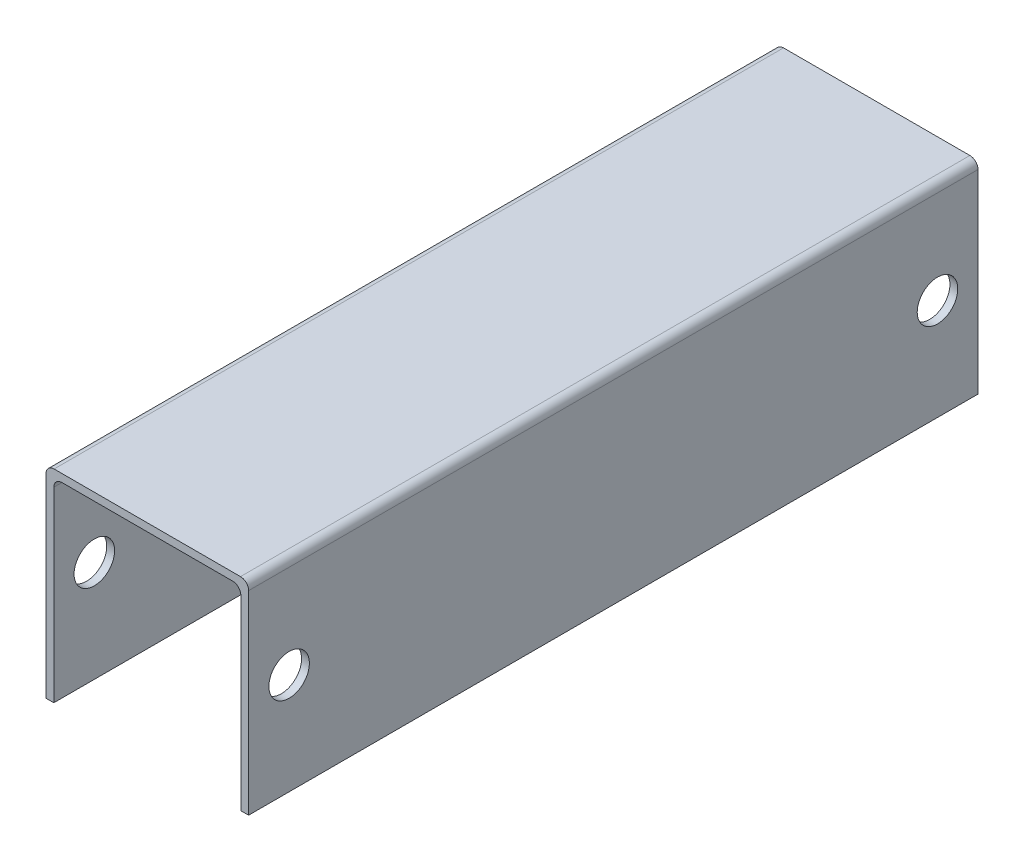
ISO-10303-21;
HEADER;
FILE_DESCRIPTION(('STEP AP214'),'2;1');
FILE_NAME('part.step','',(''),(''),'','','');
FILE_SCHEMA(('AUTOMOTIVE_DESIGN { 1 0 10303 214 1 1 1 1 }'));
ENDSEC;
DATA;
#1=APPLICATION_CONTEXT('core data for automotive mechanical design processes');
#2=APPLICATION_PROTOCOL_DEFINITION('international standard','automotive_design',2000,#1);
#3=PRODUCT_CONTEXT('',#1,'mechanical');
#4=PRODUCT('Part','Part','',(#3));
#5=PRODUCT_RELATED_PRODUCT_CATEGORY('part','',(#4));
#6=PRODUCT_DEFINITION_FORMATION('','',#4);
#7=PRODUCT_DEFINITION_CONTEXT('part definition',#1,'design');
#8=PRODUCT_DEFINITION('design','',#6,#7);
#9=PRODUCT_DEFINITION_SHAPE('','',#8);
#10=(LENGTH_UNIT() NAMED_UNIT(*) SI_UNIT(.MILLI.,.METRE.));
#11=(NAMED_UNIT(*) PLANE_ANGLE_UNIT() SI_UNIT($,.RADIAN.));
#12=(NAMED_UNIT(*) SI_UNIT($,.STERADIAN.) SOLID_ANGLE_UNIT());
#13=UNCERTAINTY_MEASURE_WITH_UNIT(LENGTH_MEASURE(1.E-05),#10,'distance_accuracy_value','');
#14=(GEOMETRIC_REPRESENTATION_CONTEXT(3) GLOBAL_UNCERTAINTY_ASSIGNED_CONTEXT((#13)) GLOBAL_UNIT_ASSIGNED_CONTEXT((#10,
#11,#12)) REPRESENTATION_CONTEXT('',''));
#15=CARTESIAN_POINT('',(0.,0.,0.));
#16=DIRECTION('',(0.,0.,1.));
#17=DIRECTION('',(1.,0.,0.));
#18=AXIS2_PLACEMENT_3D('',#15,#16,#17);
#19=CARTESIAN_POINT('',(1.92778,0.,180.));
#20=DIRECTION('',(0.,1.,0.));
#21=DIRECTION('',(-1.,0.,0.));
#22=AXIS2_PLACEMENT_3D('',#19,#20,#21);
#23=PLANE('',#22);
#24=DIRECTION('',(1.,0.,0.));
#25=VECTOR('',#24,1.);
#26=CARTESIAN_POINT('',(1.92778,0.,0.));
#27=LINE('',#26,#25);
#28=CARTESIAN_POINT('',(0.,0.,0.));
#29=VERTEX_POINT('',#28);
#30=CARTESIAN_POINT('',(1.92778,0.,0.));
#31=VERTEX_POINT('',#30);
#32=EDGE_CURVE('E156',#29,#31,#27,.T.);
#33=ORIENTED_EDGE('',*,*,#32,.T.);
#34=DIRECTION('',(0.,0.,-1.));
#35=VECTOR('',#34,1.);
#36=CARTESIAN_POINT('',(1.92778,0.,180.));
#37=LINE('',#36,#35);
#38=CARTESIAN_POINT('',(1.92778,0.,180.));
#39=VERTEX_POINT('',#38);
#40=EDGE_CURVE('E137',#39,#31,#37,.T.);
#41=ORIENTED_EDGE('',*,*,#40,.F.);
#42=DIRECTION('',(1.,0.,0.));
#43=VECTOR('',#42,1.);
#44=CARTESIAN_POINT('',(1.92778,0.,180.));
#45=LINE('',#44,#43);
#46=CARTESIAN_POINT('',(0.,0.,180.));
#47=VERTEX_POINT('',#46);
#48=EDGE_CURVE('E143',#47,#39,#45,.T.);
#49=ORIENTED_EDGE('',*,*,#48,.F.);
#50=DIRECTION('',(0.,0.,-1.));
#51=VECTOR('',#50,1.);
#52=CARTESIAN_POINT('',(0.,0.,180.));
#53=LINE('',#52,#51);
#54=EDGE_CURVE('E226',#47,#29,#53,.T.);
#55=ORIENTED_EDGE('',*,*,#54,.T.);
#56=EDGE_LOOP('',(#33,#41,#49,#55));
#57=FACE_BOUND('',#56,.T.);
#58=ADVANCED_FACE('F42',(#57),#23,.F.);
#59=CARTESIAN_POINT('',(1.92777999999999,48.07222,180.));
#60=DIRECTION('',(-1.,0.,0.));
#61=DIRECTION('',(0.,-1.,0.));
#62=AXIS2_PLACEMENT_3D('',#59,#60,#61);
#63=PLANE('',#62);
#64=CARTESIAN_POINT('',(1.92777999999999,25.,10.));
#65=DIRECTION('',(-1.,0.,0.));
#66=DIRECTION('',(0.,-1.,0.));
#67=AXIS2_PLACEMENT_3D('',#64,#65,#66);
#68=CIRCLE('',#67,5.);
#69=CARTESIAN_POINT('',(1.92777999999999,20.,10.));
#70=VERTEX_POINT('',#69);
#71=EDGE_CURVE('E228',#70,#70,#68,.T.);
#72=ORIENTED_EDGE('',*,*,#71,.T.);
#73=EDGE_LOOP('',(#72));
#74=FACE_BOUND('',#73,.T.);
#75=CARTESIAN_POINT('',(1.92777999999999,25.,170.));
#76=DIRECTION('',(-1.,0.,0.));
#77=DIRECTION('',(0.,-1.,0.));
#78=AXIS2_PLACEMENT_3D('',#75,#76,#77);
#79=CIRCLE('',#78,4.99999999999999);
#80=CARTESIAN_POINT('',(1.92777999999999,20.,170.));
#81=VERTEX_POINT('',#80);
#82=EDGE_CURVE('E308',#81,#81,#79,.T.);
#83=ORIENTED_EDGE('',*,*,#82,.T.);
#84=EDGE_LOOP('',(#83));
#85=FACE_BOUND('',#84,.T.);
#86=DIRECTION('',(0.,1.,0.));
#87=VECTOR('',#86,1.);
#88=CARTESIAN_POINT('',(1.92777999999999,48.07222,0.));
#89=LINE('',#88,#87);
#90=CARTESIAN_POINT('',(1.92777999999999,46.07222,0.));
#91=VERTEX_POINT('',#90);
#92=EDGE_CURVE('E209',#31,#91,#89,.T.);
#93=ORIENTED_EDGE('',*,*,#92,.T.);
#94=DIRECTION('',(0.,0.,-1.));
#95=VECTOR('',#94,1.);
#96=CARTESIAN_POINT('',(1.92777999999999,46.07222,180.));
#97=LINE('',#96,#95);
#98=CARTESIAN_POINT('',(1.92777999999999,46.07222,180.));
#99=VERTEX_POINT('',#98);
#100=EDGE_CURVE('E140',#91,#99,#97,.F.);
#101=ORIENTED_EDGE('',*,*,#100,.T.);
#102=DIRECTION('',(0.,1.,0.));
#103=VECTOR('',#102,1.);
#104=CARTESIAN_POINT('',(1.92777999999999,48.07222,180.));
#105=LINE('',#104,#103);
#106=EDGE_CURVE('E132',#39,#99,#105,.T.);
#107=ORIENTED_EDGE('',*,*,#106,.F.);
#108=ORIENTED_EDGE('',*,*,#40,.T.);
#109=EDGE_LOOP('',(#93,#101,#107,#108));
#110=FACE_BOUND('',#109,.T.);
#111=ADVANCED_FACE('F135',(#74,#85,#110),#63,.F.);
#112=CARTESIAN_POINT('',(48.07222,48.07222,180.));
#113=DIRECTION('',(0.,1.,0.));
#114=DIRECTION('',(-1.,0.,0.));
#115=AXIS2_PLACEMENT_3D('',#112,#113,#114);
#116=PLANE('',#115);
#117=DIRECTION('',(1.,0.,0.));
#118=VECTOR('',#117,1.);
#119=CARTESIAN_POINT('',(48.07222,48.07222,180.));
#120=LINE('',#119,#118);
#121=CARTESIAN_POINT('',(3.92778,48.07222,180.));
#122=VERTEX_POINT('',#121);
#123=CARTESIAN_POINT('',(46.07222,48.07222,180.));
#124=VERTEX_POINT('',#123);
#125=EDGE_CURVE('E142',#122,#124,#120,.T.);
#126=ORIENTED_EDGE('',*,*,#125,.F.);
#127=DIRECTION('',(0.,0.,-1.));
#128=VECTOR('',#127,1.);
#129=CARTESIAN_POINT('',(3.92778,48.07222,0.));
#130=LINE('',#129,#128);
#131=CARTESIAN_POINT('',(3.92778,48.07222,0.));
#132=VERTEX_POINT('',#131);
#133=EDGE_CURVE('E183',#122,#132,#130,.T.);
#134=ORIENTED_EDGE('',*,*,#133,.T.);
#135=DIRECTION('',(1.,0.,0.));
#136=VECTOR('',#135,1.);
#137=CARTESIAN_POINT('',(48.07222,48.07222,0.));
#138=LINE('',#137,#136);
#139=CARTESIAN_POINT('',(46.07222,48.07222,0.));
#140=VERTEX_POINT('',#139);
#141=EDGE_CURVE('E199',#132,#140,#138,.T.);
#142=ORIENTED_EDGE('',*,*,#141,.T.);
#143=DIRECTION('',(0.,0.,-1.));
#144=VECTOR('',#143,1.);
#145=CARTESIAN_POINT('',(46.07222,48.07222,180.));
#146=LINE('',#145,#144);
#147=EDGE_CURVE('E181',#140,#124,#146,.F.);
#148=ORIENTED_EDGE('',*,*,#147,.T.);
#149=EDGE_LOOP('',(#126,#134,#142,#148));
#150=FACE_BOUND('',#149,.T.);
#151=ADVANCED_FACE('F207',(#150),#116,.F.);
#152=CARTESIAN_POINT('',(48.07222,0.,180.));
#153=DIRECTION('',(1.,0.,0.));
#154=DIRECTION('',(0.,0.,-1.));
#155=AXIS2_PLACEMENT_3D('',#152,#153,#154);
#156=PLANE('',#155);
#157=CARTESIAN_POINT('',(48.07222,25.,10.));
#158=DIRECTION('',(1.,0.,0.));
#159=DIRECTION('',(0.,0.,-1.));
#160=AXIS2_PLACEMENT_3D('',#157,#158,#159);
#161=CIRCLE('',#160,5.);
#162=CARTESIAN_POINT('',(48.07222,25.,5.));
#163=VERTEX_POINT('',#162);
#164=EDGE_CURVE('E305',#163,#163,#161,.T.);
#165=ORIENTED_EDGE('',*,*,#164,.T.);
#166=EDGE_LOOP('',(#165));
#167=FACE_BOUND('',#166,.T.);
#168=CARTESIAN_POINT('',(48.07222,25.,170.));
#169=DIRECTION('',(1.,0.,0.));
#170=DIRECTION('',(0.,0.,-1.));
#171=AXIS2_PLACEMENT_3D('',#168,#169,#170);
#172=CIRCLE('',#171,4.99999999999999);
#173=CARTESIAN_POINT('',(48.07222,25.,165.));
#174=VERTEX_POINT('',#173);
#175=EDGE_CURVE('E313',#174,#174,#172,.T.);
#176=ORIENTED_EDGE('',*,*,#175,.T.);
#177=EDGE_LOOP('',(#176));
#178=FACE_BOUND('',#177,.T.);
#179=DIRECTION('',(0.,-1.,0.));
#180=VECTOR('',#179,1.);
#181=CARTESIAN_POINT('',(48.07222,0.,180.));
#182=LINE('',#181,#180);
#183=CARTESIAN_POINT('',(48.07222,46.07222,180.));
#184=VERTEX_POINT('',#183);
#185=CARTESIAN_POINT('',(48.07222,0.,180.));
#186=VERTEX_POINT('',#185);
#187=EDGE_CURVE('E214',#184,#186,#182,.T.);
#188=ORIENTED_EDGE('',*,*,#187,.F.);
#189=DIRECTION('',(0.,0.,-1.));
#190=VECTOR('',#189,1.);
#191=CARTESIAN_POINT('',(48.07222,46.07222,0.));
#192=LINE('',#191,#190);
#193=CARTESIAN_POINT('',(48.07222,46.07222,0.));
#194=VERTEX_POINT('',#193);
#195=EDGE_CURVE('E187',#184,#194,#192,.T.);
#196=ORIENTED_EDGE('',*,*,#195,.T.);
#197=DIRECTION('',(0.,-1.,0.));
#198=VECTOR('',#197,1.);
#199=CARTESIAN_POINT('',(48.07222,0.,0.));
#200=LINE('',#199,#198);
#201=CARTESIAN_POINT('',(48.07222,0.,0.));
#202=VERTEX_POINT('',#201);
#203=EDGE_CURVE('E201',#194,#202,#200,.T.);
#204=ORIENTED_EDGE('',*,*,#203,.T.);
#205=DIRECTION('',(0.,0.,-1.));
#206=VECTOR('',#205,1.);
#207=CARTESIAN_POINT('',(48.07222,0.,180.));
#208=LINE('',#207,#206);
#209=EDGE_CURVE('E158',#186,#202,#208,.T.);
#210=ORIENTED_EDGE('',*,*,#209,.F.);
#211=EDGE_LOOP('',(#188,#196,#204,#210));
#212=FACE_BOUND('',#211,.T.);
#213=ADVANCED_FACE('F212',(#167,#178,#212),#156,.F.);
#214=CARTESIAN_POINT('',(50.,0.,180.));
#215=DIRECTION('',(0.,1.,0.));
#216=DIRECTION('',(-1.,0.,0.));
#217=AXIS2_PLACEMENT_3D('',#214,#215,#216);
#218=PLANE('',#217);
#219=DIRECTION('',(1.,0.,0.));
#220=VECTOR('',#219,1.);
#221=CARTESIAN_POINT('',(50.,0.,0.));
#222=LINE('',#221,#220);
#223=CARTESIAN_POINT('',(50.,0.,0.));
#224=VERTEX_POINT('',#223);
#225=EDGE_CURVE('E231',#202,#224,#222,.T.);
#226=ORIENTED_EDGE('',*,*,#225,.T.);
#227=DIRECTION('',(0.,0.,-1.));
#228=VECTOR('',#227,1.);
#229=CARTESIAN_POINT('',(50.,0.,180.));
#230=LINE('',#229,#228);
#231=CARTESIAN_POINT('',(50.,0.,180.));
#232=VERTEX_POINT('',#231);
#233=EDGE_CURVE('E164',#232,#224,#230,.T.);
#234=ORIENTED_EDGE('',*,*,#233,.F.);
#235=DIRECTION('',(1.,0.,0.));
#236=VECTOR('',#235,1.);
#237=CARTESIAN_POINT('',(50.,0.,180.));
#238=LINE('',#237,#236);
#239=EDGE_CURVE('E216',#186,#232,#238,.T.);
#240=ORIENTED_EDGE('',*,*,#239,.F.);
#241=ORIENTED_EDGE('',*,*,#209,.T.);
#242=EDGE_LOOP('',(#226,#234,#240,#241));
#243=FACE_BOUND('',#242,.T.);
#244=ADVANCED_FACE('F332',(#243),#218,.F.);
#245=CARTESIAN_POINT('',(50.,50.,180.));
#246=DIRECTION('',(-1.,0.,0.));
#247=DIRECTION('',(0.,0.,1.));
#248=AXIS2_PLACEMENT_3D('',#245,#246,#247);
#249=PLANE('',#248);
#250=CARTESIAN_POINT('',(50.,25.,10.));
#251=DIRECTION('',(-1.,0.,0.));
#252=DIRECTION('',(0.,0.,1.));
#253=AXIS2_PLACEMENT_3D('',#250,#251,#252);
#254=CIRCLE('',#253,5.);
#255=CARTESIAN_POINT('',(50.,25.,15.));
#256=VERTEX_POINT('',#255);
#257=EDGE_CURVE('E316',#256,#256,#254,.T.);
#258=ORIENTED_EDGE('',*,*,#257,.T.);
#259=EDGE_LOOP('',(#258));
#260=FACE_BOUND('',#259,.T.);
#261=CARTESIAN_POINT('',(50.,25.,170.));
#262=DIRECTION('',(-1.,0.,0.));
#263=DIRECTION('',(0.,0.,1.));
#264=AXIS2_PLACEMENT_3D('',#261,#262,#263);
#265=CIRCLE('',#264,4.99999999999999);
#266=CARTESIAN_POINT('',(50.,25.,175.));
#267=VERTEX_POINT('',#266);
#268=EDGE_CURVE('E321',#267,#267,#265,.T.);
#269=ORIENTED_EDGE('',*,*,#268,.T.);
#270=EDGE_LOOP('',(#269));
#271=FACE_BOUND('',#270,.T.);
#272=DIRECTION('',(0.,1.,0.));
#273=VECTOR('',#272,1.);
#274=CARTESIAN_POINT('',(50.,50.,0.));
#275=LINE('',#274,#273);
#276=CARTESIAN_POINT('',(50.,48.,0.));
#277=VERTEX_POINT('',#276);
#278=EDGE_CURVE('E233',#224,#277,#275,.T.);
#279=ORIENTED_EDGE('',*,*,#278,.T.);
#280=DIRECTION('',(0.,0.,-1.));
#281=VECTOR('',#280,1.);
#282=CARTESIAN_POINT('',(50.,48.,180.));
#283=LINE('',#282,#281);
#284=CARTESIAN_POINT('',(50.,48.,180.));
#285=VERTEX_POINT('',#284);
#286=EDGE_CURVE('E57',#277,#285,#283,.F.);
#287=ORIENTED_EDGE('',*,*,#286,.T.);
#288=DIRECTION('',(0.,1.,0.));
#289=VECTOR('',#288,1.);
#290=CARTESIAN_POINT('',(50.,50.,180.));
#291=LINE('',#290,#289);
#292=EDGE_CURVE('E218',#232,#285,#291,.T.);
#293=ORIENTED_EDGE('',*,*,#292,.F.);
#294=ORIENTED_EDGE('',*,*,#233,.T.);
#295=EDGE_LOOP('',(#279,#287,#293,#294));
#296=FACE_BOUND('',#295,.T.);
#297=ADVANCED_FACE('F242',(#260,#271,#296),#249,.F.);
#298=CARTESIAN_POINT('',(0.,50.,180.));
#299=DIRECTION('',(0.,-1.,0.));
#300=DIRECTION('',(0.,0.,-1.));
#301=AXIS2_PLACEMENT_3D('',#298,#299,#300);
#302=PLANE('',#301);
#303=DIRECTION('',(-1.,0.,0.));
#304=VECTOR('',#303,1.);
#305=CARTESIAN_POINT('',(0.,50.,0.));
#306=LINE('',#305,#304);
#307=CARTESIAN_POINT('',(48.,50.,0.));
#308=VERTEX_POINT('',#307);
#309=CARTESIAN_POINT('',(2.,50.,0.));
#310=VERTEX_POINT('',#309);
#311=EDGE_CURVE('E235',#308,#310,#306,.T.);
#312=ORIENTED_EDGE('',*,*,#311,.T.);
#313=DIRECTION('',(0.,0.,-1.));
#314=VECTOR('',#313,1.);
#315=CARTESIAN_POINT('',(2.,50.,180.));
#316=LINE('',#315,#314);
#317=CARTESIAN_POINT('',(2.,50.,180.));
#318=VERTEX_POINT('',#317);
#319=EDGE_CURVE('E174',#310,#318,#316,.F.);
#320=ORIENTED_EDGE('',*,*,#319,.T.);
#321=DIRECTION('',(-1.,0.,0.));
#322=VECTOR('',#321,1.);
#323=CARTESIAN_POINT('',(0.,50.,180.));
#324=LINE('',#323,#322);
#325=CARTESIAN_POINT('',(48.,50.,180.));
#326=VERTEX_POINT('',#325);
#327=EDGE_CURVE('E223',#326,#318,#324,.T.);
#328=ORIENTED_EDGE('',*,*,#327,.F.);
#329=DIRECTION('',(0.,0.,-1.));
#330=VECTOR('',#329,1.);
#331=CARTESIAN_POINT('',(48.,50.,180.));
#332=LINE('',#331,#330);
#333=EDGE_CURVE('E171',#326,#308,#332,.T.);
#334=ORIENTED_EDGE('',*,*,#333,.T.);
#335=EDGE_LOOP('',(#312,#320,#328,#334));
#336=FACE_BOUND('',#335,.T.);
#337=ADVANCED_FACE('F251',(#336),#302,.F.);
#338=CARTESIAN_POINT('',(0.,0.,180.));
#339=DIRECTION('',(1.,0.,0.));
#340=DIRECTION('',(0.,0.,-1.));
#341=AXIS2_PLACEMENT_3D('',#338,#339,#340);
#342=PLANE('',#341);
#343=CARTESIAN_POINT('',(0.,25.,10.));
#344=DIRECTION('',(-1.,0.,0.));
#345=DIRECTION('',(0.,0.,1.));
#346=AXIS2_PLACEMENT_3D('',#343,#344,#345);
#347=CIRCLE('',#346,5.);
#348=CARTESIAN_POINT('',(0.,25.,15.));
#349=VERTEX_POINT('',#348);
#350=EDGE_CURVE('E302',#349,#349,#347,.T.);
#351=ORIENTED_EDGE('',*,*,#350,.F.);
#352=EDGE_LOOP('',(#351));
#353=FACE_BOUND('',#352,.T.);
#354=CARTESIAN_POINT('',(0.,25.,170.));
#355=DIRECTION('',(-1.,0.,0.));
#356=DIRECTION('',(0.,0.,1.));
#357=AXIS2_PLACEMENT_3D('',#354,#355,#356);
#358=CIRCLE('',#357,4.99999999999999);
#359=CARTESIAN_POINT('',(0.,25.,175.));
#360=VERTEX_POINT('',#359);
#361=EDGE_CURVE('E317',#360,#360,#358,.T.);
#362=ORIENTED_EDGE('',*,*,#361,.F.);
#363=EDGE_LOOP('',(#362));
#364=FACE_BOUND('',#363,.T.);
#365=DIRECTION('',(0.,-1.,0.));
#366=VECTOR('',#365,1.);
#367=CARTESIAN_POINT('',(0.,0.,180.));
#368=LINE('',#367,#366);
#369=CARTESIAN_POINT('',(0.,48.,180.));
#370=VERTEX_POINT('',#369);
#371=EDGE_CURVE('E149',#370,#47,#368,.T.);
#372=ORIENTED_EDGE('',*,*,#371,.F.);
#373=DIRECTION('',(0.,0.,-1.));
#374=VECTOR('',#373,1.);
#375=CARTESIAN_POINT('',(0.,48.,180.));
#376=LINE('',#375,#374);
#377=CARTESIAN_POINT('',(0.,48.,0.));
#378=VERTEX_POINT('',#377);
#379=EDGE_CURVE('E157',#370,#378,#376,.T.);
#380=ORIENTED_EDGE('',*,*,#379,.T.);
#381=DIRECTION('',(0.,-1.,0.));
#382=VECTOR('',#381,1.);
#383=CARTESIAN_POINT('',(0.,0.,0.));
#384=LINE('',#383,#382);
#385=EDGE_CURVE('E153',#378,#29,#384,.T.);
#386=ORIENTED_EDGE('',*,*,#385,.T.);
#387=ORIENTED_EDGE('',*,*,#54,.F.);
#388=EDGE_LOOP('',(#372,#380,#386,#387));
#389=FACE_BOUND('',#388,.T.);
#390=ADVANCED_FACE('F258',(#353,#364,#389),#342,.F.);
#391=CARTESIAN_POINT('',(0.,0.,180.));
#392=DIRECTION('',(0.,0.,-1.));
#393=DIRECTION('',(-1.,0.,0.));
#394=AXIS2_PLACEMENT_3D('',#391,#392,#393);
#395=PLANE('',#394);
#396=ORIENTED_EDGE('',*,*,#327,.T.);
#397=CARTESIAN_POINT('',(2.,48.,180.));
#398=DIRECTION('',(0.,0.,-1.));
#399=DIRECTION('',(-1.,0.,0.));
#400=AXIS2_PLACEMENT_3D('',#397,#398,#399);
#401=CIRCLE('',#400,2.);
#402=EDGE_CURVE('E178',#318,#370,#401,.F.);
#403=ORIENTED_EDGE('',*,*,#402,.T.);
#404=ORIENTED_EDGE('',*,*,#371,.T.);
#405=ORIENTED_EDGE('',*,*,#48,.T.);
#406=ORIENTED_EDGE('',*,*,#106,.T.);
#407=CARTESIAN_POINT('',(3.92778,46.07222,180.));
#408=DIRECTION('',(0.,0.,-1.));
#409=DIRECTION('',(-1.,0.,0.));
#410=AXIS2_PLACEMENT_3D('',#407,#408,#409);
#411=CIRCLE('',#410,2.);
#412=EDGE_CURVE('E192',#99,#122,#411,.T.);
#413=ORIENTED_EDGE('',*,*,#412,.T.);
#414=ORIENTED_EDGE('',*,*,#125,.T.);
#415=CARTESIAN_POINT('',(46.07222,46.07222,180.));
#416=DIRECTION('',(0.,0.,-1.));
#417=DIRECTION('',(-1.,0.,0.));
#418=AXIS2_PLACEMENT_3D('',#415,#416,#417);
#419=CIRCLE('',#418,2.);
#420=EDGE_CURVE('E11',#124,#184,#419,.T.);
#421=ORIENTED_EDGE('',*,*,#420,.T.);
#422=ORIENTED_EDGE('',*,*,#187,.T.);
#423=ORIENTED_EDGE('',*,*,#239,.T.);
#424=ORIENTED_EDGE('',*,*,#292,.T.);
#425=CARTESIAN_POINT('',(48.,48.,180.));
#426=DIRECTION('',(0.,0.,-1.));
#427=DIRECTION('',(-1.,0.,0.));
#428=AXIS2_PLACEMENT_3D('',#425,#426,#427);
#429=CIRCLE('',#428,2.);
#430=EDGE_CURVE('E176',#285,#326,#429,.F.);
#431=ORIENTED_EDGE('',*,*,#430,.T.);
#432=EDGE_LOOP('',(#396,#403,#404,#405,#406,#413,#414,#421,#422,#423,#424,#431));
#433=FACE_BOUND('',#432,.T.);
#434=ADVANCED_FACE('F147',(#433),#395,.F.);
#435=CARTESIAN_POINT('',(0.,0.,0.));
#436=DIRECTION('',(0.,0.,-1.));
#437=DIRECTION('',(-1.,0.,0.));
#438=AXIS2_PLACEMENT_3D('',#435,#436,#437);
#439=PLANE('',#438);
#440=ORIENTED_EDGE('',*,*,#385,.F.);
#441=CARTESIAN_POINT('',(2.,48.,0.));
#442=DIRECTION('',(0.,0.,-1.));
#443=DIRECTION('',(-1.,0.,0.));
#444=AXIS2_PLACEMENT_3D('',#441,#442,#443);
#445=CIRCLE('',#444,2.);
#446=EDGE_CURVE('E169',#378,#310,#445,.T.);
#447=ORIENTED_EDGE('',*,*,#446,.T.);
#448=ORIENTED_EDGE('',*,*,#311,.F.);
#449=CARTESIAN_POINT('',(48.,48.,0.));
#450=DIRECTION('',(0.,0.,-1.));
#451=DIRECTION('',(-1.,0.,0.));
#452=AXIS2_PLACEMENT_3D('',#449,#450,#451);
#453=CIRCLE('',#452,2.);
#454=EDGE_CURVE('E161',#308,#277,#453,.T.);
#455=ORIENTED_EDGE('',*,*,#454,.T.);
#456=ORIENTED_EDGE('',*,*,#278,.F.);
#457=ORIENTED_EDGE('',*,*,#225,.F.);
#458=ORIENTED_EDGE('',*,*,#203,.F.);
#459=CARTESIAN_POINT('',(46.07222,46.07222,0.));
#460=DIRECTION('',(0.,0.,-1.));
#461=DIRECTION('',(-1.,0.,0.));
#462=AXIS2_PLACEMENT_3D('',#459,#460,#461);
#463=CIRCLE('',#462,2.);
#464=EDGE_CURVE('E50',#194,#140,#463,.F.);
#465=ORIENTED_EDGE('',*,*,#464,.T.);
#466=ORIENTED_EDGE('',*,*,#141,.F.);
#467=CARTESIAN_POINT('',(3.92778,46.07222,0.));
#468=DIRECTION('',(0.,0.,-1.));
#469=DIRECTION('',(-1.,0.,0.));
#470=AXIS2_PLACEMENT_3D('',#467,#468,#469);
#471=CIRCLE('',#470,2.);
#472=EDGE_CURVE('E190',#132,#91,#471,.F.);
#473=ORIENTED_EDGE('',*,*,#472,.T.);
#474=ORIENTED_EDGE('',*,*,#92,.F.);
#475=ORIENTED_EDGE('',*,*,#32,.F.);
#476=EDGE_LOOP('',(#440,#447,#448,#455,#456,#457,#458,#465,#466,#473,#474,#475));
#477=FACE_BOUND('',#476,.T.);
#478=ADVANCED_FACE('F198',(#477),#439,.T.);
#479=CARTESIAN_POINT('',(50.,25.,170.));
#480=DIRECTION('',(-1.,0.,0.));
#481=DIRECTION('',(0.,0.,1.));
#482=AXIS2_PLACEMENT_3D('',#479,#480,#481);
#483=CYLINDRICAL_SURFACE('',#482,4.99999999999999);
#484=ORIENTED_EDGE('',*,*,#361,.T.);
#485=EDGE_LOOP('',(#484));
#486=FACE_BOUND('',#485,.T.);
#487=ORIENTED_EDGE('',*,*,#82,.F.);
#488=EDGE_LOOP('',(#487));
#489=FACE_BOUND('',#488,.T.);
#490=ADVANCED_FACE('F290',(#486,#489),#483,.F.);
#491=CARTESIAN_POINT('',(50.,25.,10.));
#492=DIRECTION('',(-1.,0.,0.));
#493=DIRECTION('',(0.,0.,1.));
#494=AXIS2_PLACEMENT_3D('',#491,#492,#493);
#495=CYLINDRICAL_SURFACE('',#494,5.);
#496=ORIENTED_EDGE('',*,*,#350,.T.);
#497=EDGE_LOOP('',(#496));
#498=FACE_BOUND('',#497,.T.);
#499=ORIENTED_EDGE('',*,*,#71,.F.);
#500=EDGE_LOOP('',(#499));
#501=FACE_BOUND('',#500,.T.);
#502=ADVANCED_FACE('F284',(#498,#501),#495,.F.);
#503=ORIENTED_EDGE('',*,*,#268,.F.);
#504=EDGE_LOOP('',(#503));
#505=FACE_BOUND('',#504,.T.);
#506=ORIENTED_EDGE('',*,*,#175,.F.);
#507=EDGE_LOOP('',(#506));
#508=FACE_BOUND('',#507,.T.);
#509=ADVANCED_FACE('F281',(#505,#508),#483,.F.);
#510=ORIENTED_EDGE('',*,*,#257,.F.);
#511=EDGE_LOOP('',(#510));
#512=FACE_BOUND('',#511,.T.);
#513=ORIENTED_EDGE('',*,*,#164,.F.);
#514=EDGE_LOOP('',(#513));
#515=FACE_BOUND('',#514,.T.);
#516=ADVANCED_FACE('F277',(#512,#515),#495,.F.);
#517=CARTESIAN_POINT('',(2.,48.,180.));
#518=DIRECTION('',(0.,0.,-1.));
#519=DIRECTION('',(-1.,0.,0.));
#520=AXIS2_PLACEMENT_3D('',#517,#518,#519);
#521=CYLINDRICAL_SURFACE('',#520,2.);
#522=ORIENTED_EDGE('',*,*,#402,.F.);
#523=ORIENTED_EDGE('',*,*,#319,.F.);
#524=ORIENTED_EDGE('',*,*,#446,.F.);
#525=ORIENTED_EDGE('',*,*,#379,.F.);
#526=EDGE_LOOP('',(#522,#523,#524,#525));
#527=FACE_BOUND('',#526,.T.);
#528=ADVANCED_FACE('F256',(#527),#521,.T.);
#529=CARTESIAN_POINT('',(48.,48.,180.));
#530=DIRECTION('',(0.,0.,-1.));
#531=DIRECTION('',(-1.,0.,0.));
#532=AXIS2_PLACEMENT_3D('',#529,#530,#531);
#533=CYLINDRICAL_SURFACE('',#532,2.);
#534=ORIENTED_EDGE('',*,*,#430,.F.);
#535=ORIENTED_EDGE('',*,*,#286,.F.);
#536=ORIENTED_EDGE('',*,*,#454,.F.);
#537=ORIENTED_EDGE('',*,*,#333,.F.);
#538=EDGE_LOOP('',(#534,#535,#536,#537));
#539=FACE_BOUND('',#538,.T.);
#540=ADVANCED_FACE('F248',(#539),#533,.T.);
#541=CARTESIAN_POINT('',(3.92778,46.07222,180.));
#542=DIRECTION('',(0.,0.,1.));
#543=DIRECTION('',(1.,0.,0.));
#544=AXIS2_PLACEMENT_3D('',#541,#542,#543);
#545=CYLINDRICAL_SURFACE('',#544,2.);
#546=ORIENTED_EDGE('',*,*,#412,.F.);
#547=ORIENTED_EDGE('',*,*,#100,.F.);
#548=ORIENTED_EDGE('',*,*,#472,.F.);
#549=ORIENTED_EDGE('',*,*,#133,.F.);
#550=EDGE_LOOP('',(#546,#547,#548,#549));
#551=FACE_BOUND('',#550,.T.);
#552=ADVANCED_FACE('F260',(#551),#545,.F.);
#553=CARTESIAN_POINT('',(46.07222,46.07222,180.));
#554=DIRECTION('',(0.,0.,1.));
#555=DIRECTION('',(1.,0.,0.));
#556=AXIS2_PLACEMENT_3D('',#553,#554,#555);
#557=CYLINDRICAL_SURFACE('',#556,2.);
#558=ORIENTED_EDGE('',*,*,#420,.F.);
#559=ORIENTED_EDGE('',*,*,#147,.F.);
#560=ORIENTED_EDGE('',*,*,#464,.F.);
#561=ORIENTED_EDGE('',*,*,#195,.F.);
#562=EDGE_LOOP('',(#558,#559,#560,#561));
#563=FACE_BOUND('',#562,.T.);
#564=ADVANCED_FACE('F44',(#563),#557,.F.);
#565=CLOSED_SHELL('',(#58,#111,#151,#213,#244,#297,#337,#390,#434,#478,#490,#502,#509,#516,#528,
#540,#552,#564));
#566=MANIFOLD_SOLID_BREP('B2',#565);
#567=ADVANCED_BREP_SHAPE_REPRESENTATION('',(#18,#566),#14);
#568=SHAPE_DEFINITION_REPRESENTATION(#9,#567);
ENDSEC;
END-ISO-10303-21;
